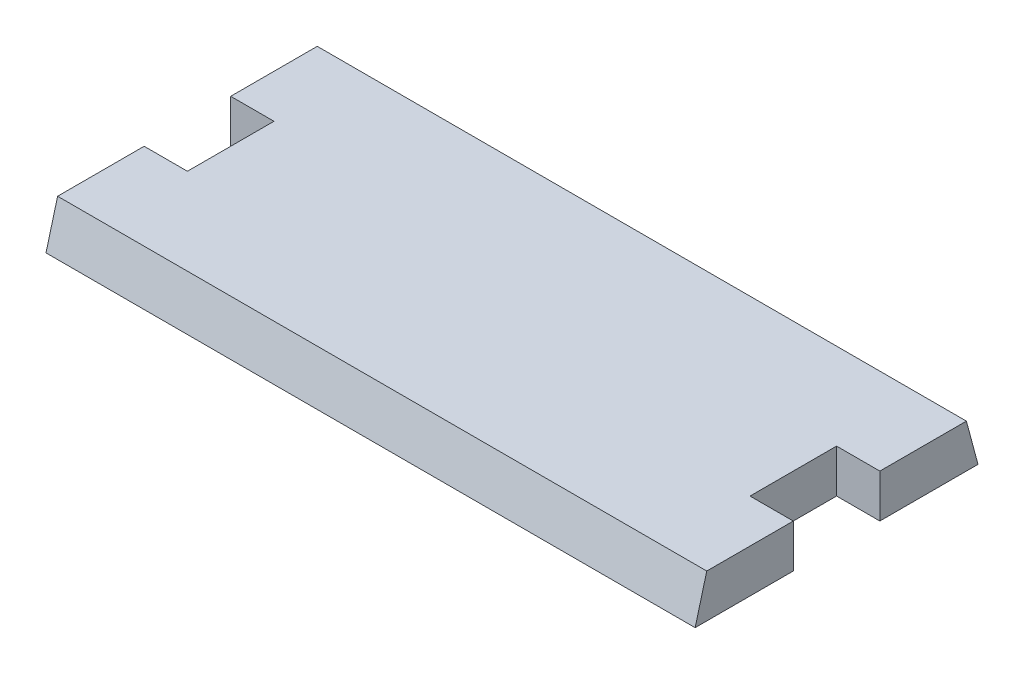
ISO-10303-21;
HEADER;
FILE_DESCRIPTION(('STEP AP214'),'2;1');
FILE_NAME('part.step','',(''),(''),'','','');
FILE_SCHEMA(('AUTOMOTIVE_DESIGN { 1 0 10303 214 1 1 1 1 }'));
ENDSEC;
DATA;
#1=APPLICATION_CONTEXT('core data for automotive mechanical design processes');
#2=APPLICATION_PROTOCOL_DEFINITION('international standard','automotive_design',2000,#1);
#3=PRODUCT_CONTEXT('',#1,'mechanical');
#4=PRODUCT('Part','Part','',(#3));
#5=PRODUCT_RELATED_PRODUCT_CATEGORY('part','',(#4));
#6=PRODUCT_DEFINITION_FORMATION('','',#4);
#7=PRODUCT_DEFINITION_CONTEXT('part definition',#1,'design');
#8=PRODUCT_DEFINITION('design','',#6,#7);
#9=PRODUCT_DEFINITION_SHAPE('','',#8);
#10=(LENGTH_UNIT() NAMED_UNIT(*) SI_UNIT(.MILLI.,.METRE.));
#11=(NAMED_UNIT(*) PLANE_ANGLE_UNIT() SI_UNIT($,.RADIAN.));
#12=(NAMED_UNIT(*) SI_UNIT($,.STERADIAN.) SOLID_ANGLE_UNIT());
#13=UNCERTAINTY_MEASURE_WITH_UNIT(LENGTH_MEASURE(1.E-05),#10,'distance_accuracy_value','');
#14=(GEOMETRIC_REPRESENTATION_CONTEXT(3) GLOBAL_UNCERTAINTY_ASSIGNED_CONTEXT((#13)) GLOBAL_UNIT_ASSIGNED_CONTEXT((#10,
#11,#12)) REPRESENTATION_CONTEXT('',''));
#15=CARTESIAN_POINT('',(0.,0.,0.));
#16=DIRECTION('',(0.,0.,1.));
#17=DIRECTION('',(1.,0.,0.));
#18=AXIS2_PLACEMENT_3D('',#15,#16,#17);
#19=CARTESIAN_POINT('',(75.,10.,10.));
#20=DIRECTION('',(-1.,0.,0.));
#21=DIRECTION('',(0.,0.,1.));
#22=AXIS2_PLACEMENT_3D('',#19,#20,#21);
#23=PLANE('',#22);
#24=DIRECTION('',(0.,0.,-1.));
#25=VECTOR('',#24,1.);
#26=CARTESIAN_POINT('',(75.,0.,10.));
#27=LINE('',#26,#25);
#28=CARTESIAN_POINT('',(75.,0.,32.6794919243112));
#29=VERTEX_POINT('',#28);
#30=CARTESIAN_POINT('',(75.,0.,10.));
#31=VERTEX_POINT('',#30);
#32=EDGE_CURVE('E227',#29,#31,#27,.T.);
#33=ORIENTED_EDGE('',*,*,#32,.T.);
#34=DIRECTION('',(0.,-1.,0.));
#35=VECTOR('',#34,1.);
#36=CARTESIAN_POINT('',(75.,10.,10.));
#37=LINE('',#36,#35);
#38=CARTESIAN_POINT('',(75.,10.,10.));
#39=VERTEX_POINT('',#38);
#40=EDGE_CURVE('E11',#39,#31,#37,.T.);
#41=ORIENTED_EDGE('',*,*,#40,.F.);
#42=DIRECTION('',(0.,0.,-1.));
#43=VECTOR('',#42,1.);
#44=CARTESIAN_POINT('',(75.,10.,10.));
#45=LINE('',#44,#43);
#46=CARTESIAN_POINT('',(75.,10.,30.));
#47=VERTEX_POINT('',#46);
#48=EDGE_CURVE('E175',#47,#39,#45,.T.);
#49=ORIENTED_EDGE('',*,*,#48,.F.);
#50=DIRECTION('',(0.,0.965925826289068,-0.258819045102521));
#51=VECTOR('',#50,1.);
#52=CARTESIAN_POINT('',(75.,15.,28.6602540378444));
#53=LINE('',#52,#51);
#54=EDGE_CURVE('E179',#47,#29,#53,.F.);
#55=ORIENTED_EDGE('',*,*,#54,.T.);
#56=EDGE_LOOP('',(#33,#41,#49,#55));
#57=FACE_BOUND('',#56,.T.);
#58=ADVANCED_FACE('F39',(#57),#23,.F.);
#59=CARTESIAN_POINT('',(75.,10.,10.));
#60=DIRECTION('',(0.,0.,1.));
#61=DIRECTION('',(1.,0.,0.));
#62=AXIS2_PLACEMENT_3D('',#59,#60,#61);
#63=PLANE('',#62);
#64=DIRECTION('',(-1.,0.,0.));
#65=VECTOR('',#64,1.);
#66=CARTESIAN_POINT('',(75.,0.,10.));
#67=LINE('',#66,#65);
#68=CARTESIAN_POINT('',(65.,0.,10.));
#69=VERTEX_POINT('',#68);
#70=EDGE_CURVE('E231',#31,#69,#67,.T.);
#71=ORIENTED_EDGE('',*,*,#70,.T.);
#72=DIRECTION('',(0.,-1.,0.));
#73=VECTOR('',#72,1.);
#74=CARTESIAN_POINT('',(65.,10.,10.));
#75=LINE('',#74,#73);
#76=CARTESIAN_POINT('',(65.,10.,10.));
#77=VERTEX_POINT('',#76);
#78=EDGE_CURVE('E50',#77,#69,#75,.T.);
#79=ORIENTED_EDGE('',*,*,#78,.F.);
#80=DIRECTION('',(-1.,0.,0.));
#81=VECTOR('',#80,1.);
#82=CARTESIAN_POINT('',(75.,10.,10.));
#83=LINE('',#82,#81);
#84=EDGE_CURVE('E218',#39,#77,#83,.T.);
#85=ORIENTED_EDGE('',*,*,#84,.F.);
#86=ORIENTED_EDGE('',*,*,#40,.T.);
#87=EDGE_LOOP('',(#71,#79,#85,#86));
#88=FACE_BOUND('',#87,.T.);
#89=ADVANCED_FACE('F282',(#88),#63,.F.);
#90=CARTESIAN_POINT('',(65.,10.,10.));
#91=DIRECTION('',(-1.,0.,0.));
#92=DIRECTION('',(0.,0.,1.));
#93=AXIS2_PLACEMENT_3D('',#90,#91,#92);
#94=PLANE('',#93);
#95=DIRECTION('',(0.,0.,-1.));
#96=VECTOR('',#95,1.);
#97=CARTESIAN_POINT('',(65.,0.,10.));
#98=LINE('',#97,#96);
#99=CARTESIAN_POINT('',(65.,0.,-10.));
#100=VERTEX_POINT('',#99);
#101=EDGE_CURVE('E234',#69,#100,#98,.T.);
#102=ORIENTED_EDGE('',*,*,#101,.T.);
#103=DIRECTION('',(0.,-1.,0.));
#104=VECTOR('',#103,1.);
#105=CARTESIAN_POINT('',(65.,10.,-10.));
#106=LINE('',#105,#104);
#107=CARTESIAN_POINT('',(65.,10.,-10.));
#108=VERTEX_POINT('',#107);
#109=EDGE_CURVE('E166',#108,#100,#106,.T.);
#110=ORIENTED_EDGE('',*,*,#109,.F.);
#111=DIRECTION('',(0.,0.,-1.));
#112=VECTOR('',#111,1.);
#113=CARTESIAN_POINT('',(65.,10.,10.));
#114=LINE('',#113,#112);
#115=EDGE_CURVE('E214',#77,#108,#114,.T.);
#116=ORIENTED_EDGE('',*,*,#115,.F.);
#117=ORIENTED_EDGE('',*,*,#78,.T.);
#118=EDGE_LOOP('',(#102,#110,#116,#117));
#119=FACE_BOUND('',#118,.T.);
#120=ADVANCED_FACE('F287',(#119),#94,.F.);
#121=CARTESIAN_POINT('',(75.,10.,-10.));
#122=DIRECTION('',(0.,0.,-1.));
#123=DIRECTION('',(-1.,0.,0.));
#124=AXIS2_PLACEMENT_3D('',#121,#122,#123);
#125=PLANE('',#124);
#126=DIRECTION('',(1.,0.,0.));
#127=VECTOR('',#126,1.);
#128=CARTESIAN_POINT('',(75.,0.,-10.));
#129=LINE('',#128,#127);
#130=CARTESIAN_POINT('',(75.,0.,-10.));
#131=VERTEX_POINT('',#130);
#132=EDGE_CURVE('E236',#100,#131,#129,.T.);
#133=ORIENTED_EDGE('',*,*,#132,.T.);
#134=DIRECTION('',(0.,-1.,0.));
#135=VECTOR('',#134,1.);
#136=CARTESIAN_POINT('',(75.,10.,-10.));
#137=LINE('',#136,#135);
#138=CARTESIAN_POINT('',(75.,10.,-10.));
#139=VERTEX_POINT('',#138);
#140=EDGE_CURVE('E163',#139,#131,#137,.T.);
#141=ORIENTED_EDGE('',*,*,#140,.F.);
#142=DIRECTION('',(1.,0.,0.));
#143=VECTOR('',#142,1.);
#144=CARTESIAN_POINT('',(75.,10.,-10.));
#145=LINE('',#144,#143);
#146=EDGE_CURVE('E210',#108,#139,#145,.T.);
#147=ORIENTED_EDGE('',*,*,#146,.F.);
#148=ORIENTED_EDGE('',*,*,#109,.T.);
#149=EDGE_LOOP('',(#133,#141,#147,#148));
#150=FACE_BOUND('',#149,.T.);
#151=ADVANCED_FACE('F242',(#150),#125,.F.);
#152=CARTESIAN_POINT('',(75.,10.,-30.));
#153=DIRECTION('',(-1.,0.,0.));
#154=DIRECTION('',(0.,0.,1.));
#155=AXIS2_PLACEMENT_3D('',#152,#153,#154);
#156=PLANE('',#155);
#157=DIRECTION('',(0.,0.,-1.));
#158=VECTOR('',#157,1.);
#159=CARTESIAN_POINT('',(75.,0.,-30.));
#160=LINE('',#159,#158);
#161=CARTESIAN_POINT('',(75.,0.,-32.6794919243112));
#162=VERTEX_POINT('',#161);
#163=EDGE_CURVE('E101',#131,#162,#160,.T.);
#164=ORIENTED_EDGE('',*,*,#163,.T.);
#165=DIRECTION('',(0.,0.965925826289068,0.258819045102521));
#166=VECTOR('',#165,1.);
#167=CARTESIAN_POINT('',(75.,10.,-30.));
#168=LINE('',#167,#166);
#169=CARTESIAN_POINT('',(75.,10.,-30.));
#170=VERTEX_POINT('',#169);
#171=EDGE_CURVE('E112',#170,#162,#168,.F.);
#172=ORIENTED_EDGE('',*,*,#171,.F.);
#173=DIRECTION('',(0.,0.,-1.));
#174=VECTOR('',#173,1.);
#175=CARTESIAN_POINT('',(75.,10.,-30.));
#176=LINE('',#175,#174);
#177=EDGE_CURVE('E206',#139,#170,#176,.T.);
#178=ORIENTED_EDGE('',*,*,#177,.F.);
#179=ORIENTED_EDGE('',*,*,#140,.T.);
#180=EDGE_LOOP('',(#164,#172,#178,#179));
#181=FACE_BOUND('',#180,.T.);
#182=ADVANCED_FACE('F248',(#181),#156,.F.);
#183=CARTESIAN_POINT('',(-75.,10.,-30.));
#184=DIRECTION('',(0.,0.258819045102521,-0.965925826289068));
#185=DIRECTION('',(0.,0.965925826289068,0.258819045102521));
#186=AXIS2_PLACEMENT_3D('',#183,#184,#185);
#187=PLANE('',#186);
#188=DIRECTION('',(1.,0.,0.));
#189=VECTOR('',#188,1.);
#190=CARTESIAN_POINT('',(-75.,0.,-32.6794919243112));
#191=LINE('',#190,#189);
#192=CARTESIAN_POINT('',(-75.,0.,-32.6794919243112));
#193=VERTEX_POINT('',#192);
#194=EDGE_CURVE('E107',#162,#193,#191,.F.);
#195=ORIENTED_EDGE('',*,*,#194,.T.);
#196=DIRECTION('',(0.,0.965925826289068,0.258819045102521));
#197=VECTOR('',#196,1.);
#198=CARTESIAN_POINT('',(-75.,10.,-30.));
#199=LINE('',#198,#197);
#200=CARTESIAN_POINT('',(-75.,10.,-30.));
#201=VERTEX_POINT('',#200);
#202=EDGE_CURVE('E43',#201,#193,#199,.F.);
#203=ORIENTED_EDGE('',*,*,#202,.F.);
#204=DIRECTION('',(-1.,0.,0.));
#205=VECTOR('',#204,1.);
#206=CARTESIAN_POINT('',(-75.,10.,-30.));
#207=LINE('',#206,#205);
#208=EDGE_CURVE('E202',#170,#201,#207,.T.);
#209=ORIENTED_EDGE('',*,*,#208,.F.);
#210=ORIENTED_EDGE('',*,*,#171,.T.);
#211=EDGE_LOOP('',(#195,#203,#209,#210));
#212=FACE_BOUND('',#211,.T.);
#213=ADVANCED_FACE('F41',(#212),#187,.T.);
#214=CARTESIAN_POINT('',(-75.,10.,-30.));
#215=DIRECTION('',(1.,0.,0.));
#216=DIRECTION('',(0.,0.,-1.));
#217=AXIS2_PLACEMENT_3D('',#214,#215,#216);
#218=PLANE('',#217);
#219=DIRECTION('',(0.,0.,1.));
#220=VECTOR('',#219,1.);
#221=CARTESIAN_POINT('',(-75.,0.,-30.));
#222=LINE('',#221,#220);
#223=CARTESIAN_POINT('',(-75.,0.,-10.));
#224=VERTEX_POINT('',#223);
#225=EDGE_CURVE('E116',#193,#224,#222,.T.);
#226=ORIENTED_EDGE('',*,*,#225,.T.);
#227=DIRECTION('',(0.,-1.,0.));
#228=VECTOR('',#227,1.);
#229=CARTESIAN_POINT('',(-75.,10.,-10.));
#230=LINE('',#229,#228);
#231=CARTESIAN_POINT('',(-75.,10.,-10.));
#232=VERTEX_POINT('',#231);
#233=EDGE_CURVE('E125',#232,#224,#230,.T.);
#234=ORIENTED_EDGE('',*,*,#233,.F.);
#235=DIRECTION('',(0.,0.,1.));
#236=VECTOR('',#235,1.);
#237=CARTESIAN_POINT('',(-75.,10.,-30.));
#238=LINE('',#237,#236);
#239=EDGE_CURVE('E123',#201,#232,#238,.T.);
#240=ORIENTED_EDGE('',*,*,#239,.F.);
#241=ORIENTED_EDGE('',*,*,#202,.T.);
#242=EDGE_LOOP('',(#226,#234,#240,#241));
#243=FACE_BOUND('',#242,.T.);
#244=ADVANCED_FACE('F119',(#243),#218,.F.);
#245=CARTESIAN_POINT('',(-75.,10.,-10.));
#246=DIRECTION('',(0.,0.,-1.));
#247=DIRECTION('',(-1.,0.,0.));
#248=AXIS2_PLACEMENT_3D('',#245,#246,#247);
#249=PLANE('',#248);
#250=DIRECTION('',(1.,0.,0.));
#251=VECTOR('',#250,1.);
#252=CARTESIAN_POINT('',(-75.,0.,-10.));
#253=LINE('',#252,#251);
#254=CARTESIAN_POINT('',(-65.,0.,-10.));
#255=VERTEX_POINT('',#254);
#256=EDGE_CURVE('E130',#224,#255,#253,.T.);
#257=ORIENTED_EDGE('',*,*,#256,.T.);
#258=DIRECTION('',(0.,-1.,0.));
#259=VECTOR('',#258,1.);
#260=CARTESIAN_POINT('',(-65.,10.,-10.));
#261=LINE('',#260,#259);
#262=CARTESIAN_POINT('',(-65.,10.,-10.));
#263=VERTEX_POINT('',#262);
#264=EDGE_CURVE('E157',#263,#255,#261,.T.);
#265=ORIENTED_EDGE('',*,*,#264,.F.);
#266=DIRECTION('',(1.,0.,0.));
#267=VECTOR('',#266,1.);
#268=CARTESIAN_POINT('',(-75.,10.,-10.));
#269=LINE('',#268,#267);
#270=EDGE_CURVE('E196',#232,#263,#269,.T.);
#271=ORIENTED_EDGE('',*,*,#270,.F.);
#272=ORIENTED_EDGE('',*,*,#233,.T.);
#273=EDGE_LOOP('',(#257,#265,#271,#272));
#274=FACE_BOUND('',#273,.T.);
#275=ADVANCED_FACE('F293',(#274),#249,.F.);
#276=CARTESIAN_POINT('',(-65.,10.,10.));
#277=DIRECTION('',(1.,0.,0.));
#278=DIRECTION('',(0.,0.,-1.));
#279=AXIS2_PLACEMENT_3D('',#276,#277,#278);
#280=PLANE('',#279);
#281=DIRECTION('',(0.,0.,1.));
#282=VECTOR('',#281,1.);
#283=CARTESIAN_POINT('',(-65.,0.,10.));
#284=LINE('',#283,#282);
#285=CARTESIAN_POINT('',(-65.,0.,10.));
#286=VERTEX_POINT('',#285);
#287=EDGE_CURVE('E134',#255,#286,#284,.T.);
#288=ORIENTED_EDGE('',*,*,#287,.T.);
#289=DIRECTION('',(0.,-1.,0.));
#290=VECTOR('',#289,1.);
#291=CARTESIAN_POINT('',(-65.,10.,10.));
#292=LINE('',#291,#290);
#293=CARTESIAN_POINT('',(-65.,10.,10.));
#294=VERTEX_POINT('',#293);
#295=EDGE_CURVE('E152',#294,#286,#292,.T.);
#296=ORIENTED_EDGE('',*,*,#295,.F.);
#297=DIRECTION('',(0.,0.,1.));
#298=VECTOR('',#297,1.);
#299=CARTESIAN_POINT('',(-65.,10.,10.));
#300=LINE('',#299,#298);
#301=EDGE_CURVE('E192',#263,#294,#300,.T.);
#302=ORIENTED_EDGE('',*,*,#301,.F.);
#303=ORIENTED_EDGE('',*,*,#264,.T.);
#304=EDGE_LOOP('',(#288,#296,#302,#303));
#305=FACE_BOUND('',#304,.T.);
#306=ADVANCED_FACE('F289',(#305),#280,.F.);
#307=CARTESIAN_POINT('',(-75.,10.,10.));
#308=DIRECTION('',(0.,0.,1.));
#309=DIRECTION('',(1.,0.,0.));
#310=AXIS2_PLACEMENT_3D('',#307,#308,#309);
#311=PLANE('',#310);
#312=DIRECTION('',(-1.,0.,0.));
#313=VECTOR('',#312,1.);
#314=CARTESIAN_POINT('',(-75.,0.,10.));
#315=LINE('',#314,#313);
#316=CARTESIAN_POINT('',(-75.,0.,10.));
#317=VERTEX_POINT('',#316);
#318=EDGE_CURVE('E141',#286,#317,#315,.T.);
#319=ORIENTED_EDGE('',*,*,#318,.T.);
#320=DIRECTION('',(0.,-1.,0.));
#321=VECTOR('',#320,1.);
#322=CARTESIAN_POINT('',(-75.,10.,10.));
#323=LINE('',#322,#321);
#324=CARTESIAN_POINT('',(-75.,10.,10.));
#325=VERTEX_POINT('',#324);
#326=EDGE_CURVE('E148',#325,#317,#323,.T.);
#327=ORIENTED_EDGE('',*,*,#326,.F.);
#328=DIRECTION('',(-1.,0.,0.));
#329=VECTOR('',#328,1.);
#330=CARTESIAN_POINT('',(-75.,10.,10.));
#331=LINE('',#330,#329);
#332=EDGE_CURVE('E188',#294,#325,#331,.T.);
#333=ORIENTED_EDGE('',*,*,#332,.F.);
#334=ORIENTED_EDGE('',*,*,#295,.T.);
#335=EDGE_LOOP('',(#319,#327,#333,#334));
#336=FACE_BOUND('',#335,.T.);
#337=ADVANCED_FACE('F269',(#336),#311,.F.);
#338=CARTESIAN_POINT('',(-75.,10.,10.));
#339=DIRECTION('',(1.,0.,0.));
#340=DIRECTION('',(0.,0.,-1.));
#341=AXIS2_PLACEMENT_3D('',#338,#339,#340);
#342=PLANE('',#341);
#343=DIRECTION('',(0.,0.,1.));
#344=VECTOR('',#343,1.);
#345=CARTESIAN_POINT('',(-75.,0.,10.));
#346=LINE('',#345,#344);
#347=CARTESIAN_POINT('',(-75.,0.,32.6794919243112));
#348=VERTEX_POINT('',#347);
#349=EDGE_CURVE('E144',#317,#348,#346,.T.);
#350=ORIENTED_EDGE('',*,*,#349,.T.);
#351=DIRECTION('',(0.,0.965925826289068,-0.258819045102521));
#352=VECTOR('',#351,1.);
#353=CARTESIAN_POINT('',(-75.,10.,30.));
#354=LINE('',#353,#352);
#355=CARTESIAN_POINT('',(-75.,10.,30.));
#356=VERTEX_POINT('',#355);
#357=EDGE_CURVE('E153',#356,#348,#354,.F.);
#358=ORIENTED_EDGE('',*,*,#357,.F.);
#359=DIRECTION('',(0.,0.,1.));
#360=VECTOR('',#359,1.);
#361=CARTESIAN_POINT('',(-75.,10.,10.));
#362=LINE('',#361,#360);
#363=EDGE_CURVE('E185',#325,#356,#362,.T.);
#364=ORIENTED_EDGE('',*,*,#363,.F.);
#365=ORIENTED_EDGE('',*,*,#326,.T.);
#366=EDGE_LOOP('',(#350,#358,#364,#365));
#367=FACE_BOUND('',#366,.T.);
#368=ADVANCED_FACE('F273',(#367),#342,.F.);
#369=CARTESIAN_POINT('',(-75.,10.,30.));
#370=DIRECTION('',(0.,0.258819045102521,0.965925826289068));
#371=DIRECTION('',(0.,-0.965925826289068,0.258819045102521));
#372=AXIS2_PLACEMENT_3D('',#369,#370,#371);
#373=PLANE('',#372);
#374=DIRECTION('',(-1.,0.,0.));
#375=VECTOR('',#374,1.);
#376=CARTESIAN_POINT('',(-75.,0.,32.6794919243112));
#377=LINE('',#376,#375);
#378=EDGE_CURVE('E147',#348,#29,#377,.F.);
#379=ORIENTED_EDGE('',*,*,#378,.T.);
#380=ORIENTED_EDGE('',*,*,#54,.F.);
#381=DIRECTION('',(1.,0.,0.));
#382=VECTOR('',#381,1.);
#383=CARTESIAN_POINT('',(-75.,10.,30.));
#384=LINE('',#383,#382);
#385=EDGE_CURVE('E59',#356,#47,#384,.T.);
#386=ORIENTED_EDGE('',*,*,#385,.F.);
#387=ORIENTED_EDGE('',*,*,#357,.T.);
#388=EDGE_LOOP('',(#379,#380,#386,#387));
#389=FACE_BOUND('',#388,.T.);
#390=ADVANCED_FACE('F276',(#389),#373,.T.);
#391=CARTESIAN_POINT('',(0.,10.,0.));
#392=DIRECTION('',(0.,1.,0.));
#393=DIRECTION('',(0.,0.,1.));
#394=AXIS2_PLACEMENT_3D('',#391,#392,#393);
#395=PLANE('',#394);
#396=ORIENTED_EDGE('',*,*,#48,.T.);
#397=ORIENTED_EDGE('',*,*,#84,.T.);
#398=ORIENTED_EDGE('',*,*,#115,.T.);
#399=ORIENTED_EDGE('',*,*,#146,.T.);
#400=ORIENTED_EDGE('',*,*,#177,.T.);
#401=ORIENTED_EDGE('',*,*,#208,.T.);
#402=ORIENTED_EDGE('',*,*,#239,.T.);
#403=ORIENTED_EDGE('',*,*,#270,.T.);
#404=ORIENTED_EDGE('',*,*,#301,.T.);
#405=ORIENTED_EDGE('',*,*,#332,.T.);
#406=ORIENTED_EDGE('',*,*,#363,.T.);
#407=ORIENTED_EDGE('',*,*,#385,.T.);
#408=EDGE_LOOP('',(#396,#397,#398,#399,#400,#401,#402,#403,#404,#405,#406,#407));
#409=FACE_BOUND('',#408,.T.);
#410=ADVANCED_FACE('F252',(#409),#395,.T.);
#411=CARTESIAN_POINT('',(0.,0.,0.));
#412=DIRECTION('',(0.,1.,0.));
#413=DIRECTION('',(0.,0.,1.));
#414=AXIS2_PLACEMENT_3D('',#411,#412,#413);
#415=PLANE('',#414);
#416=ORIENTED_EDGE('',*,*,#32,.F.);
#417=ORIENTED_EDGE('',*,*,#378,.F.);
#418=ORIENTED_EDGE('',*,*,#349,.F.);
#419=ORIENTED_EDGE('',*,*,#318,.F.);
#420=ORIENTED_EDGE('',*,*,#287,.F.);
#421=ORIENTED_EDGE('',*,*,#256,.F.);
#422=ORIENTED_EDGE('',*,*,#225,.F.);
#423=ORIENTED_EDGE('',*,*,#194,.F.);
#424=ORIENTED_EDGE('',*,*,#163,.F.);
#425=ORIENTED_EDGE('',*,*,#132,.F.);
#426=ORIENTED_EDGE('',*,*,#101,.F.);
#427=ORIENTED_EDGE('',*,*,#70,.F.);
#428=EDGE_LOOP('',(#416,#417,#418,#419,#420,#421,#422,#423,#424,#425,#426,#427));
#429=FACE_BOUND('',#428,.T.);
#430=ADVANCED_FACE('F128',(#429),#415,.F.);
#431=CLOSED_SHELL('',(#58,#89,#120,#151,#182,#213,#244,#275,#306,#337,#368,#390,#410,#430));
#432=MANIFOLD_SOLID_BREP('B2',#431);
#433=ADVANCED_BREP_SHAPE_REPRESENTATION('',(#18,#432),#14);
#434=SHAPE_DEFINITION_REPRESENTATION(#9,#433);
ENDSEC;
END-ISO-10303-21;
